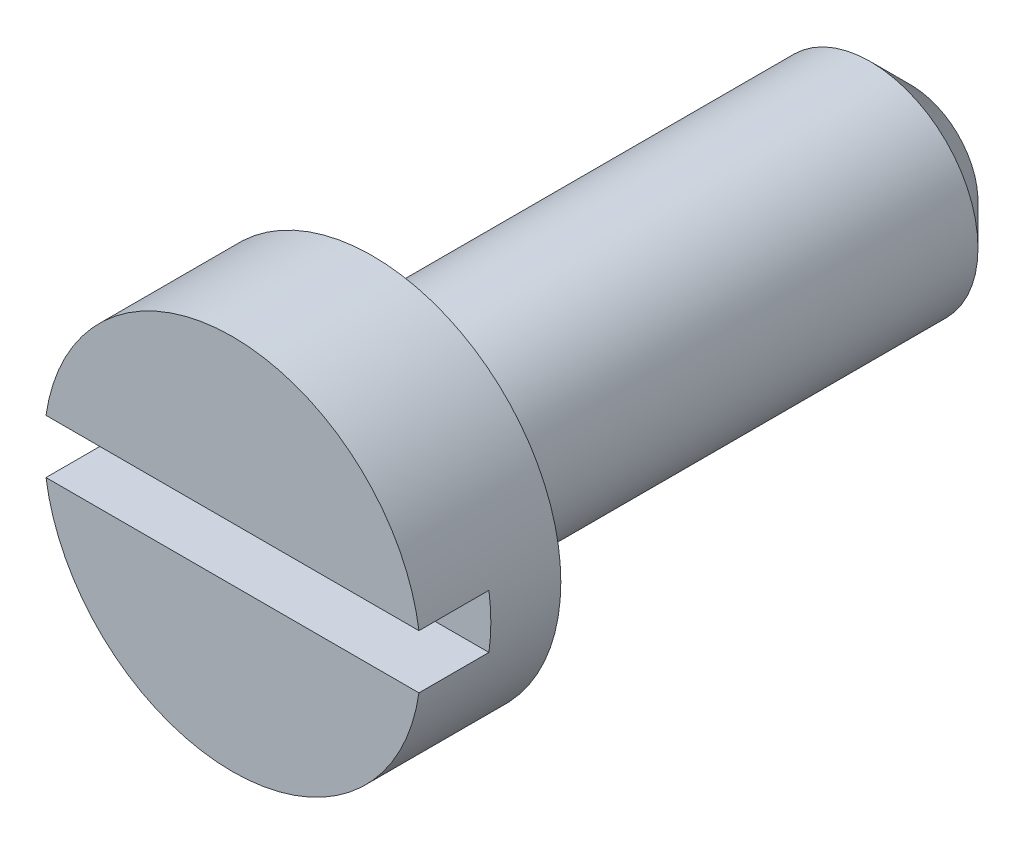
ISO-10303-21;
HEADER;
FILE_DESCRIPTION(('STEP AP214'),'2;1');
FILE_NAME('part.step','',(''),(''),'','','');
FILE_SCHEMA(('AUTOMOTIVE_DESIGN { 1 0 10303 214 1 1 1 1 }'));
ENDSEC;
DATA;
#1=APPLICATION_CONTEXT('core data for automotive mechanical design processes');
#2=APPLICATION_PROTOCOL_DEFINITION('international standard','automotive_design',2000,#1);
#3=PRODUCT_CONTEXT('',#1,'mechanical');
#4=PRODUCT('Part','Part','',(#3));
#5=PRODUCT_RELATED_PRODUCT_CATEGORY('part','',(#4));
#6=PRODUCT_DEFINITION_FORMATION('','',#4);
#7=PRODUCT_DEFINITION_CONTEXT('part definition',#1,'design');
#8=PRODUCT_DEFINITION('design','',#6,#7);
#9=PRODUCT_DEFINITION_SHAPE('','',#8);
#10=(LENGTH_UNIT() NAMED_UNIT(*) SI_UNIT(.MILLI.,.METRE.));
#11=(NAMED_UNIT(*) PLANE_ANGLE_UNIT() SI_UNIT($,.RADIAN.));
#12=(NAMED_UNIT(*) SI_UNIT($,.STERADIAN.) SOLID_ANGLE_UNIT());
#13=UNCERTAINTY_MEASURE_WITH_UNIT(LENGTH_MEASURE(1.E-05),#10,'distance_accuracy_value','');
#14=(GEOMETRIC_REPRESENTATION_CONTEXT(3) GLOBAL_UNCERTAINTY_ASSIGNED_CONTEXT((#13)) GLOBAL_UNIT_ASSIGNED_CONTEXT((#10,
#11,#12)) REPRESENTATION_CONTEXT('',''));
#15=CARTESIAN_POINT('',(0.,0.,0.));
#16=DIRECTION('',(0.,0.,1.));
#17=DIRECTION('',(1.,0.,0.));
#18=AXIS2_PLACEMENT_3D('',#15,#16,#17);
#19=CARTESIAN_POINT('',(0.,0.,2.6));
#20=DIRECTION('',(0.,0.,1.));
#21=DIRECTION('',(1.,0.,0.));
#22=AXIS2_PLACEMENT_3D('',#19,#20,#21);
#23=PLANE('',#22);
#24=DIRECTION('',(-1.,0.,0.));
#25=VECTOR('',#24,1.);
#26=CARTESIAN_POINT('',(0.,0.5,2.6));
#27=LINE('',#26,#25);
#28=CARTESIAN_POINT('',(3.46410161513775,0.5,2.6));
#29=VERTEX_POINT('',#28);
#30=CARTESIAN_POINT('',(-3.46410161513775,0.5,2.6));
#31=VERTEX_POINT('',#30);
#32=EDGE_CURVE('E77',#29,#31,#27,.T.);
#33=ORIENTED_EDGE('',*,*,#32,.F.);
#34=CARTESIAN_POINT('',(0.,0.,2.6));
#35=DIRECTION('',(0.,0.,1.));
#36=DIRECTION('',(1.,0.,0.));
#37=AXIS2_PLACEMENT_3D('',#34,#35,#36);
#38=CIRCLE('',#37,3.5);
#39=EDGE_CURVE('E90',#29,#31,#38,.T.);
#40=ORIENTED_EDGE('',*,*,#39,.T.);
#41=EDGE_LOOP('',(#33,#40));
#42=FACE_BOUND('',#41,.T.);
#43=ADVANCED_FACE('F29',(#42),#23,.T.);
#44=CARTESIAN_POINT('',(0.,0.,0.));
#45=DIRECTION('',(0.,0.,1.));
#46=DIRECTION('',(1.,0.,0.));
#47=AXIS2_PLACEMENT_3D('',#44,#45,#46);
#48=PLANE('',#47);
#49=CARTESIAN_POINT('',(0.,0.,0.));
#50=DIRECTION('',(0.,0.,1.));
#51=DIRECTION('',(1.,0.,0.));
#52=AXIS2_PLACEMENT_3D('',#49,#50,#51);
#53=CIRCLE('',#52,3.5);
#54=CARTESIAN_POINT('',(3.5,0.,0.));
#55=VERTEX_POINT('',#54);
#56=EDGE_CURVE('E91',#55,#55,#53,.T.);
#57=ORIENTED_EDGE('',*,*,#56,.F.);
#58=EDGE_LOOP('',(#57));
#59=FACE_BOUND('',#58,.T.);
#60=CARTESIAN_POINT('',(0.,0.,0.));
#61=DIRECTION('',(0.,0.,1.));
#62=DIRECTION('',(1.,0.,0.));
#63=AXIS2_PLACEMENT_3D('',#60,#61,#62);
#64=CIRCLE('',#63,2.);
#65=CARTESIAN_POINT('',(2.,0.,0.));
#66=VERTEX_POINT('',#65);
#67=EDGE_CURVE('E78',#66,#66,#64,.F.);
#68=ORIENTED_EDGE('',*,*,#67,.F.);
#69=EDGE_LOOP('',(#68));
#70=FACE_BOUND('',#69,.T.);
#71=ADVANCED_FACE('F118',(#59,#70),#48,.F.);
#72=CARTESIAN_POINT('',(0.,0.,2.6));
#73=DIRECTION('',(0.,0.,-1.));
#74=DIRECTION('',(-1.,0.,0.));
#75=AXIS2_PLACEMENT_3D('',#72,#73,#74);
#76=CYLINDRICAL_SURFACE('',#75,3.5);
#77=CARTESIAN_POINT('',(0.,0.,1.3));
#78=DIRECTION('',(0.,0.,1.));
#79=DIRECTION('',(1.,0.,0.));
#80=AXIS2_PLACEMENT_3D('',#77,#78,#79);
#81=CIRCLE('',#80,3.5);
#82=CARTESIAN_POINT('',(-3.46410161513775,0.5,1.3));
#83=VERTEX_POINT('',#82);
#84=CARTESIAN_POINT('',(-3.46410161513775,-0.5,1.3));
#85=VERTEX_POINT('',#84);
#86=EDGE_CURVE('E102',#83,#85,#81,.T.);
#87=ORIENTED_EDGE('',*,*,#86,.F.);
#88=DIRECTION('',(0.,0.,-1.));
#89=VECTOR('',#88,1.);
#90=CARTESIAN_POINT('',(-3.46410161513775,0.5,2.6));
#91=LINE('',#90,#89);
#92=EDGE_CURVE('E52',#83,#31,#91,.F.);
#93=ORIENTED_EDGE('',*,*,#92,.T.);
#94=ORIENTED_EDGE('',*,*,#39,.F.);
#95=DIRECTION('',(0.,0.,-1.));
#96=VECTOR('',#95,1.);
#97=CARTESIAN_POINT('',(3.46410161513775,0.5,2.6));
#98=LINE('',#97,#96);
#99=CARTESIAN_POINT('',(3.46410161513775,0.5,1.3));
#100=VERTEX_POINT('',#99);
#101=EDGE_CURVE('E95',#29,#100,#98,.T.);
#102=ORIENTED_EDGE('',*,*,#101,.T.);
#103=CARTESIAN_POINT('',(3.46410161513775,-0.5,1.3));
#104=VERTEX_POINT('',#103);
#105=EDGE_CURVE('E86',#104,#100,#81,.T.);
#106=ORIENTED_EDGE('',*,*,#105,.F.);
#107=DIRECTION('',(0.,0.,-1.));
#108=VECTOR('',#107,1.);
#109=CARTESIAN_POINT('',(3.46410161513775,-0.5,2.6));
#110=LINE('',#109,#108);
#111=CARTESIAN_POINT('',(3.46410161513775,-0.5,2.6));
#112=VERTEX_POINT('',#111);
#113=EDGE_CURVE('E72',#104,#112,#110,.F.);
#114=ORIENTED_EDGE('',*,*,#113,.T.);
#115=CARTESIAN_POINT('',(-3.46410161513775,-0.5,2.6));
#116=VERTEX_POINT('',#115);
#117=EDGE_CURVE('E84',#116,#112,#38,.T.);
#118=ORIENTED_EDGE('',*,*,#117,.F.);
#119=DIRECTION('',(0.,0.,-1.));
#120=VECTOR('',#119,1.);
#121=CARTESIAN_POINT('',(-3.46410161513775,-0.5,2.6));
#122=LINE('',#121,#120);
#123=EDGE_CURVE('E44',#116,#85,#122,.T.);
#124=ORIENTED_EDGE('',*,*,#123,.T.);
#125=EDGE_LOOP('',(#87,#93,#94,#102,#106,#114,#118,#124));
#126=FACE_BOUND('',#125,.T.);
#127=ORIENTED_EDGE('',*,*,#56,.T.);
#128=EDGE_LOOP('',(#127));
#129=FACE_BOUND('',#128,.T.);
#130=ADVANCED_FACE('F31',(#126,#129),#76,.T.);
#131=DIRECTION('',(1.,0.,0.));
#132=VECTOR('',#131,1.);
#133=CARTESIAN_POINT('',(0.,-0.5,2.6));
#134=LINE('',#133,#132);
#135=EDGE_CURVE('E69',#116,#112,#134,.T.);
#136=ORIENTED_EDGE('',*,*,#135,.F.);
#137=ORIENTED_EDGE('',*,*,#117,.T.);
#138=EDGE_LOOP('',(#136,#137));
#139=FACE_BOUND('',#138,.T.);
#140=ADVANCED_FACE('F89',(#139),#23,.T.);
#141=CARTESIAN_POINT('',(0.,0.,-10.));
#142=DIRECTION('',(0.,0.,1.));
#143=DIRECTION('',(1.,0.,0.));
#144=AXIS2_PLACEMENT_3D('',#141,#142,#143);
#145=CYLINDRICAL_SURFACE('',#144,2.);
#146=CARTESIAN_POINT('',(0.,0.,-9.25));
#147=DIRECTION('',(0.,0.,-1.));
#148=DIRECTION('',(-1.,0.,0.));
#149=AXIS2_PLACEMENT_3D('',#146,#147,#148);
#150=CIRCLE('',#149,2.);
#151=CARTESIAN_POINT('',(-2.,0.,-9.25));
#152=VERTEX_POINT('',#151);
#153=EDGE_CURVE('E11',#152,#152,#150,.F.);
#154=ORIENTED_EDGE('',*,*,#153,.T.);
#155=EDGE_LOOP('',(#154));
#156=FACE_BOUND('',#155,.T.);
#157=ORIENTED_EDGE('',*,*,#67,.T.);
#158=EDGE_LOOP('',(#157));
#159=FACE_BOUND('',#158,.T.);
#160=ADVANCED_FACE('F126',(#156,#159),#145,.T.);
#161=CARTESIAN_POINT('',(0.,0.,-10.));
#162=DIRECTION('',(0.,0.,-1.));
#163=DIRECTION('',(-1.,0.,0.));
#164=AXIS2_PLACEMENT_3D('',#161,#162,#163);
#165=PLANE('',#164);
#166=CARTESIAN_POINT('',(0.,0.,-10.));
#167=DIRECTION('',(0.,0.,-1.));
#168=DIRECTION('',(-1.,0.,0.));
#169=AXIS2_PLACEMENT_3D('',#166,#167,#168);
#170=CIRCLE('',#169,1.25);
#171=CARTESIAN_POINT('',(-1.25,0.,-10.));
#172=VERTEX_POINT('',#171);
#173=EDGE_CURVE('E37',#172,#172,#170,.T.);
#174=ORIENTED_EDGE('',*,*,#173,.T.);
#175=EDGE_LOOP('',(#174));
#176=FACE_BOUND('',#175,.T.);
#177=ADVANCED_FACE('F131',(#176),#165,.T.);
#178=CARTESIAN_POINT('',(-4.09803921568627,-0.5,1.3));
#179=DIRECTION('',(0.,0.,1.));
#180=DIRECTION('',(1.,0.,0.));
#181=AXIS2_PLACEMENT_3D('',#178,#179,#180);
#182=PLANE('',#181);
#183=ORIENTED_EDGE('',*,*,#86,.T.);
#184=DIRECTION('',(1.,0.,0.));
#185=VECTOR('',#184,1.);
#186=CARTESIAN_POINT('',(-4.09803921568627,-0.5,1.3));
#187=LINE('',#186,#185);
#188=EDGE_CURVE('E108',#85,#104,#187,.T.);
#189=ORIENTED_EDGE('',*,*,#188,.T.);
#190=ORIENTED_EDGE('',*,*,#105,.T.);
#191=DIRECTION('',(-1.,0.,0.));
#192=VECTOR('',#191,1.);
#193=CARTESIAN_POINT('',(-4.09803921568627,0.5,1.3));
#194=LINE('',#193,#192);
#195=EDGE_CURVE('E87',#100,#83,#194,.T.);
#196=ORIENTED_EDGE('',*,*,#195,.T.);
#197=EDGE_LOOP('',(#183,#189,#190,#196));
#198=FACE_BOUND('',#197,.T.);
#199=ADVANCED_FACE('F107',(#198),#182,.T.);
#200=CARTESIAN_POINT('',(-4.09803921568627,0.5,1.3));
#201=DIRECTION('',(0.,1.,0.));
#202=DIRECTION('',(0.,0.,1.));
#203=AXIS2_PLACEMENT_3D('',#200,#201,#202);
#204=PLANE('',#203);
#205=ORIENTED_EDGE('',*,*,#32,.T.);
#206=ORIENTED_EDGE('',*,*,#92,.F.);
#207=ORIENTED_EDGE('',*,*,#195,.F.);
#208=ORIENTED_EDGE('',*,*,#101,.F.);
#209=EDGE_LOOP('',(#205,#206,#207,#208));
#210=FACE_BOUND('',#209,.T.);
#211=ADVANCED_FACE('F115',(#210),#204,.F.);
#212=CARTESIAN_POINT('',(-4.09803921568627,-0.5,1.3));
#213=DIRECTION('',(0.,-1.,0.));
#214=DIRECTION('',(0.,0.,-1.));
#215=AXIS2_PLACEMENT_3D('',#212,#213,#214);
#216=PLANE('',#215);
#217=ORIENTED_EDGE('',*,*,#135,.T.);
#218=ORIENTED_EDGE('',*,*,#113,.F.);
#219=ORIENTED_EDGE('',*,*,#188,.F.);
#220=ORIENTED_EDGE('',*,*,#123,.F.);
#221=EDGE_LOOP('',(#217,#218,#219,#220));
#222=FACE_BOUND('',#221,.T.);
#223=ADVANCED_FACE('F71',(#222),#216,.F.);
#224=CARTESIAN_POINT('',(0.,0.,-10.));
#225=DIRECTION('',(0.,0.,1.));
#226=DIRECTION('',(1.,0.,0.));
#227=AXIS2_PLACEMENT_3D('',#224,#225,#226);
#228=CONICAL_SURFACE('',#227,1.25,0.785398163397446);
#229=ORIENTED_EDGE('',*,*,#153,.F.);
#230=EDGE_LOOP('',(#229));
#231=FACE_BOUND('',#230,.T.);
#232=ORIENTED_EDGE('',*,*,#173,.F.);
#233=EDGE_LOOP('',(#232));
#234=FACE_BOUND('',#233,.T.);
#235=ADVANCED_FACE('F173',(#231,#234),#228,.T.);
#236=CLOSED_SHELL('',(#43,#71,#130,#140,#160,#177,#199,#211,#223,#235));
#237=MANIFOLD_SOLID_BREP('B2',#236);
#238=ADVANCED_BREP_SHAPE_REPRESENTATION('',(#18,#237),#14);
#239=SHAPE_DEFINITION_REPRESENTATION(#9,#238);
ENDSEC;
END-ISO-10303-21;
